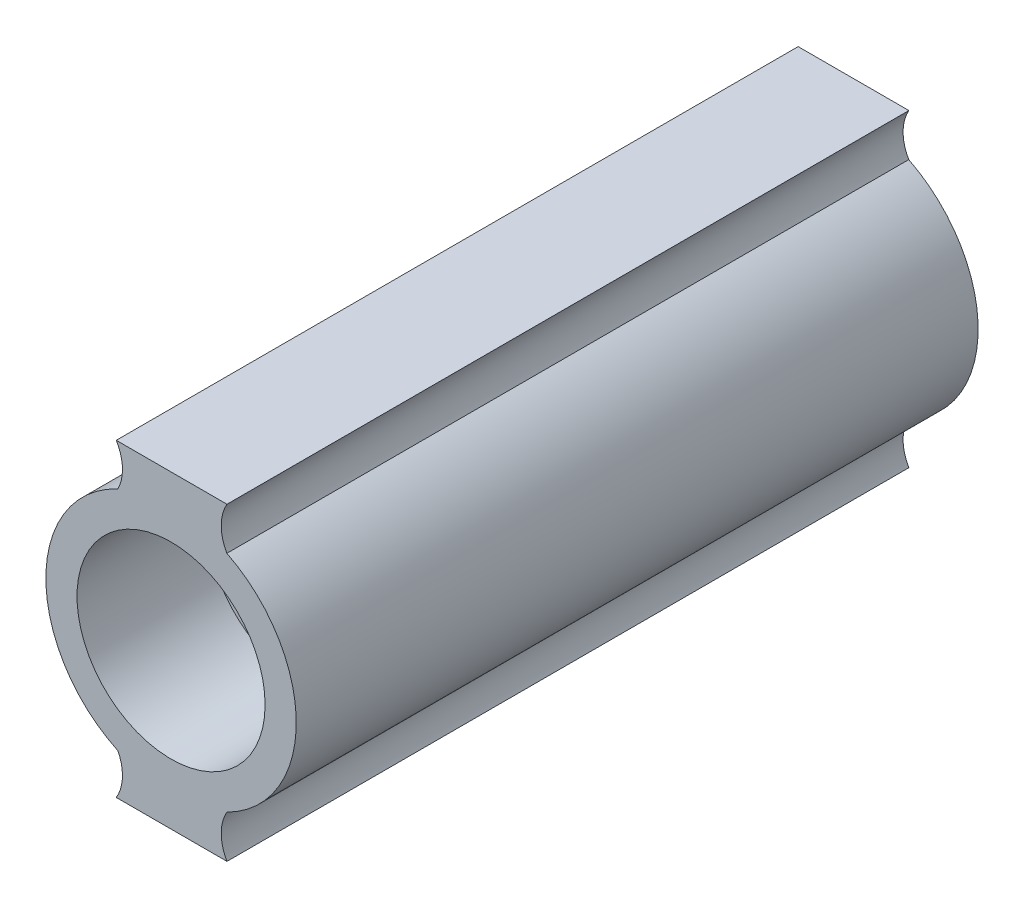
ISO-10303-21;
HEADER;
FILE_DESCRIPTION(('STEP AP214'),'2;1');
FILE_NAME('part.step','',(''),(''),'','','');
FILE_SCHEMA(('AUTOMOTIVE_DESIGN { 1 0 10303 214 1 1 1 1 }'));
ENDSEC;
DATA;
#1=APPLICATION_CONTEXT('core data for automotive mechanical design processes');
#2=APPLICATION_PROTOCOL_DEFINITION('international standard','automotive_design',2000,#1);
#3=PRODUCT_CONTEXT('',#1,'mechanical');
#4=PRODUCT('Part','Part','',(#3));
#5=PRODUCT_RELATED_PRODUCT_CATEGORY('part','',(#4));
#6=PRODUCT_DEFINITION_FORMATION('','',#4);
#7=PRODUCT_DEFINITION_CONTEXT('part definition',#1,'design');
#8=PRODUCT_DEFINITION('design','',#6,#7);
#9=PRODUCT_DEFINITION_SHAPE('','',#8);
#10=(LENGTH_UNIT() NAMED_UNIT(*) SI_UNIT(.MILLI.,.METRE.));
#11=(NAMED_UNIT(*) PLANE_ANGLE_UNIT() SI_UNIT($,.RADIAN.));
#12=(NAMED_UNIT(*) SI_UNIT($,.STERADIAN.) SOLID_ANGLE_UNIT());
#13=UNCERTAINTY_MEASURE_WITH_UNIT(LENGTH_MEASURE(1.E-05),#10,'distance_accuracy_value','');
#14=(GEOMETRIC_REPRESENTATION_CONTEXT(3) GLOBAL_UNCERTAINTY_ASSIGNED_CONTEXT((#13)) GLOBAL_UNIT_ASSIGNED_CONTEXT((#10,
#11,#12)) REPRESENTATION_CONTEXT('',''));
#15=CARTESIAN_POINT('',(0.,0.,0.));
#16=DIRECTION('',(0.,0.,1.));
#17=DIRECTION('',(1.,0.,0.));
#18=AXIS2_PLACEMENT_3D('',#15,#16,#17);
#19=CARTESIAN_POINT('',(-8.08770481711657,2.88846600611306,21.4122));
#20=DIRECTION('',(0.,0.,-1.));
#21=DIRECTION('',(-1.,0.,0.));
#22=AXIS2_PLACEMENT_3D('',#19,#20,#21);
#23=CYLINDRICAL_SURFACE('',#22,18.669);
#24=DIRECTION('',(0.,0.,1.));
#25=VECTOR('',#24,1.);
#26=CARTESIAN_POINT('',(-16.0119195359533,-14.0153318538287,0.));
#27=LINE('',#26,#25);
#28=CARTESIAN_POINT('',(-16.0119195359533,-14.0153318538287,-80.264));
#29=VERTEX_POINT('',#28);
#30=CARTESIAN_POINT('',(-16.0119195359533,-14.0153318538287,21.4122));
#31=VERTEX_POINT('',#30);
#32=EDGE_CURVE('E132',#29,#31,#27,.T.);
#33=ORIENTED_EDGE('',*,*,#32,.T.);
#34=CARTESIAN_POINT('',(-8.08770481711657,2.88846600611306,21.4122));
#35=DIRECTION('',(0.,0.,1.));
#36=DIRECTION('',(1.,0.,0.));
#37=AXIS2_PLACEMENT_3D('',#34,#35,#36);
#38=CIRCLE('',#37,18.669);
#39=CARTESIAN_POINT('',(-16.0119195359533,19.7922638660548,21.4122));
#40=VERTEX_POINT('',#39);
#41=EDGE_CURVE('E204',#40,#31,#38,.T.);
#42=ORIENTED_EDGE('',*,*,#41,.F.);
#43=DIRECTION('',(0.,0.,1.));
#44=VECTOR('',#43,1.);
#45=CARTESIAN_POINT('',(-16.0119195359533,19.7922638660548,0.));
#46=LINE('',#45,#44);
#47=CARTESIAN_POINT('',(-16.0119195359533,19.7922638660548,-80.264));
#48=VERTEX_POINT('',#47);
#49=EDGE_CURVE('E146',#48,#40,#46,.T.);
#50=ORIENTED_EDGE('',*,*,#49,.F.);
#51=CARTESIAN_POINT('',(-8.08770481711657,2.88846600611306,-80.264));
#52=DIRECTION('',(0.,0.,-1.));
#53=DIRECTION('',(-1.,0.,0.));
#54=AXIS2_PLACEMENT_3D('',#51,#52,#53);
#55=CIRCLE('',#54,18.669);
#56=EDGE_CURVE('E145',#29,#48,#55,.T.);
#57=ORIENTED_EDGE('',*,*,#56,.F.);
#58=EDGE_LOOP('',(#33,#42,#50,#57));
#59=FACE_BOUND('',#58,.T.);
#60=ADVANCED_FACE('F65',(#59),#23,.T.);
#61=CARTESIAN_POINT('',(0.233391542479405,-13.8235331673646,21.4122));
#62=VERTEX_POINT('',#61);
#63=CARTESIAN_POINT('',(0.233391542479406,19.6004651795907,21.4122));
#64=VERTEX_POINT('',#63);
#65=EDGE_CURVE('E203',#62,#64,#38,.T.);
#66=ORIENTED_EDGE('',*,*,#65,.F.);
#67=DIRECTION('',(0.,0.,1.));
#68=VECTOR('',#67,1.);
#69=CARTESIAN_POINT('',(0.233391542479405,-13.8235331673646,0.));
#70=LINE('',#69,#68);
#71=CARTESIAN_POINT('',(0.233391542479411,-13.8235331673646,-80.264));
#72=VERTEX_POINT('',#71);
#73=EDGE_CURVE('E142',#72,#62,#70,.T.);
#74=ORIENTED_EDGE('',*,*,#73,.F.);
#75=CARTESIAN_POINT('',(-8.08770481711657,2.88846600611306,-80.264));
#76=DIRECTION('',(0.,0.,-1.));
#77=DIRECTION('',(-1.,0.,0.));
#78=AXIS2_PLACEMENT_3D('',#75,#76,#77);
#79=CIRCLE('',#78,18.669);
#80=CARTESIAN_POINT('',(0.233391542479412,19.6004651795907,-80.264));
#81=VERTEX_POINT('',#80);
#82=EDGE_CURVE('E171',#81,#72,#79,.T.);
#83=ORIENTED_EDGE('',*,*,#82,.F.);
#84=DIRECTION('',(0.,0.,1.));
#85=VECTOR('',#84,1.);
#86=CARTESIAN_POINT('',(0.233391542479406,19.6004651795907,0.));
#87=LINE('',#86,#85);
#88=EDGE_CURVE('E192',#81,#64,#87,.T.);
#89=ORIENTED_EDGE('',*,*,#88,.T.);
#90=EDGE_LOOP('',(#66,#74,#83,#89));
#91=FACE_BOUND('',#90,.T.);
#92=ADVANCED_FACE('F283',(#91),#23,.T.);
#93=CARTESIAN_POINT('',(0.,0.,0.00254));
#94=DIRECTION('',(0.,0.,1.));
#95=DIRECTION('',(1.,0.,0.));
#96=AXIS2_PLACEMENT_3D('',#93,#94,#95);
#97=PLANE('',#96);
#98=CARTESIAN_POINT('',(-8.08770481711657,11.2387160061131,0.00254));
#99=DIRECTION('',(0.,0.,1.));
#100=DIRECTION('',(1.,0.,0.));
#101=AXIS2_PLACEMENT_3D('',#98,#99,#100);
#102=ELLIPSE('',#101,3.2131,3.20675);
#103=CARTESIAN_POINT('',(-4.87460481711657,11.2387160061131,0.00254));
#104=VERTEX_POINT('',#103);
#105=EDGE_CURVE('E12',#104,#104,#102,.T.);
#106=ORIENTED_EDGE('',*,*,#105,.T.);
#107=EDGE_LOOP('',(#106));
#108=FACE_BOUND('',#107,.T.);
#109=ADVANCED_FACE('F67',(#108),#97,.T.);
#110=CARTESIAN_POINT('',(0.,0.,1.9812));
#111=DIRECTION('',(0.,0.,1.));
#112=DIRECTION('',(1.,0.,0.));
#113=AXIS2_PLACEMENT_3D('',#110,#111,#112);
#114=PLANE('',#113);
#115=CARTESIAN_POINT('',(0.262545182883519,2.88846600611303,1.9812));
#116=DIRECTION('',(0.,0.,1.));
#117=DIRECTION('',(0.,-1.,0.));
#118=AXIS2_PLACEMENT_3D('',#115,#116,#117);
#119=ELLIPSE('',#118,3.2131,3.20675);
#120=CARTESIAN_POINT('',(0.262545182883508,-0.324633993886968,1.9812));
#121=VERTEX_POINT('',#120);
#122=EDGE_CURVE('E228',#121,#121,#119,.T.);
#123=ORIENTED_EDGE('',*,*,#122,.F.);
#124=EDGE_LOOP('',(#123));
#125=FACE_BOUND('',#124,.T.);
#126=CARTESIAN_POINT('',(-8.08770481711657,11.2387160061131,1.9812));
#127=DIRECTION('',(0.,0.,1.));
#128=DIRECTION('',(1.,0.,0.));
#129=AXIS2_PLACEMENT_3D('',#126,#127,#128);
#130=ELLIPSE('',#129,3.2131,3.20675);
#131=CARTESIAN_POINT('',(-4.87460481711657,11.2387160061131,1.9812));
#132=VERTEX_POINT('',#131);
#133=EDGE_CURVE('E246',#132,#132,#130,.T.);
#134=ORIENTED_EDGE('',*,*,#133,.F.);
#135=EDGE_LOOP('',(#134));
#136=FACE_BOUND('',#135,.T.);
#137=CARTESIAN_POINT('',(-16.4379548171166,2.88846600611315,1.9812));
#138=DIRECTION('',(0.,0.,1.));
#139=DIRECTION('',(0.,1.,0.));
#140=AXIS2_PLACEMENT_3D('',#137,#138,#139);
#141=ELLIPSE('',#140,3.2131,3.20675);
#142=CARTESIAN_POINT('',(-16.4379548171166,6.10156600611315,1.9812));
#143=VERTEX_POINT('',#142);
#144=EDGE_CURVE('E73',#143,#143,#141,.T.);
#145=ORIENTED_EDGE('',*,*,#144,.F.);
#146=EDGE_LOOP('',(#145));
#147=FACE_BOUND('',#146,.T.);
#148=CARTESIAN_POINT('',(-8.08770481711657,-5.46178399388694,1.9812));
#149=DIRECTION('',(0.,0.,1.));
#150=DIRECTION('',(-1.,0.,0.));
#151=AXIS2_PLACEMENT_3D('',#148,#149,#150);
#152=ELLIPSE('',#151,3.2131,3.20675);
#153=CARTESIAN_POINT('',(-11.3008048171166,-5.46178399388694,1.9812));
#154=VERTEX_POINT('',#153);
#155=EDGE_CURVE('E222',#154,#154,#152,.T.);
#156=ORIENTED_EDGE('',*,*,#155,.F.);
#157=EDGE_LOOP('',(#156));
#158=FACE_BOUND('',#157,.T.);
#159=CARTESIAN_POINT('',(-8.08770481711657,2.88846600611306,1.9812));
#160=DIRECTION('',(0.,0.,1.));
#161=DIRECTION('',(1.,0.,0.));
#162=AXIS2_PLACEMENT_3D('',#159,#160,#161);
#163=CIRCLE('',#162,4.7625000000001);
#164=CARTESIAN_POINT('',(-3.32520481711647,2.88846600611306,1.9812));
#165=VERTEX_POINT('',#164);
#166=EDGE_CURVE('E219',#165,#165,#163,.T.);
#167=ORIENTED_EDGE('',*,*,#166,.F.);
#168=EDGE_LOOP('',(#167));
#169=FACE_BOUND('',#168,.T.);
#170=CARTESIAN_POINT('',(-8.08770481711657,2.88846600611306,1.9812));
#171=DIRECTION('',(0.,0.,1.));
#172=DIRECTION('',(1.,0.,0.));
#173=AXIS2_PLACEMENT_3D('',#170,#171,#172);
#174=CIRCLE('',#173,14.02334);
#175=CARTESIAN_POINT('',(5.93563518288343,2.88846600611306,1.9812));
#176=VERTEX_POINT('',#175);
#177=EDGE_CURVE('E206',#176,#176,#174,.F.);
#178=ORIENTED_EDGE('',*,*,#177,.F.);
#179=EDGE_LOOP('',(#178));
#180=FACE_BOUND('',#179,.T.);
#181=ADVANCED_FACE('F235',(#125,#136,#147,#158,#169,#180),#114,.T.);
#182=DIRECTION('',(0.,0.,-1.));
#183=VECTOR('',#182,1.);
#184=SURFACE_OF_LINEAR_EXTRUSION('',#152,#183);
#185=CARTESIAN_POINT('',(-8.08770481711657,-5.46178399388694,0.00254));
#186=DIRECTION('',(0.,0.,1.));
#187=DIRECTION('',(-1.,0.,0.));
#188=AXIS2_PLACEMENT_3D('',#185,#186,#187);
#189=ELLIPSE('',#188,3.2131,3.20675);
#190=CARTESIAN_POINT('',(-11.3008048171166,-5.46178399388694,0.00254));
#191=VERTEX_POINT('',#190);
#192=EDGE_CURVE('E212',#191,#191,#189,.T.);
#193=ORIENTED_EDGE('',*,*,#192,.F.);
#194=EDGE_LOOP('',(#193));
#195=FACE_BOUND('',#194,.T.);
#196=ORIENTED_EDGE('',*,*,#155,.T.);
#197=EDGE_LOOP('',(#196));
#198=FACE_BOUND('',#197,.T.);
#199=ADVANCED_FACE('F231',(#195,#198),#184,.T.);
#200=DIRECTION('',(0.,0.,-1.));
#201=VECTOR('',#200,1.);
#202=SURFACE_OF_LINEAR_EXTRUSION('',#119,#201);
#203=CARTESIAN_POINT('',(0.262545182883519,2.88846600611303,0.00254));
#204=DIRECTION('',(0.,0.,1.));
#205=DIRECTION('',(0.,-1.,0.));
#206=AXIS2_PLACEMENT_3D('',#203,#204,#205);
#207=ELLIPSE('',#206,3.2131,3.20675);
#208=CARTESIAN_POINT('',(0.262545182883508,-0.324633993886968,0.00254));
#209=VERTEX_POINT('',#208);
#210=EDGE_CURVE('E209',#209,#209,#207,.T.);
#211=ORIENTED_EDGE('',*,*,#210,.F.);
#212=EDGE_LOOP('',(#211));
#213=FACE_BOUND('',#212,.T.);
#214=ORIENTED_EDGE('',*,*,#122,.T.);
#215=EDGE_LOOP('',(#214));
#216=FACE_BOUND('',#215,.T.);
#217=ADVANCED_FACE('F234',(#213,#216),#202,.T.);
#218=DIRECTION('',(0.,0.,-1.));
#219=VECTOR('',#218,1.);
#220=SURFACE_OF_LINEAR_EXTRUSION('',#130,#219);
#221=ORIENTED_EDGE('',*,*,#105,.F.);
#222=EDGE_LOOP('',(#221));
#223=FACE_BOUND('',#222,.T.);
#224=ORIENTED_EDGE('',*,*,#133,.T.);
#225=EDGE_LOOP('',(#224));
#226=FACE_BOUND('',#225,.T.);
#227=ADVANCED_FACE('F239',(#223,#226),#220,.T.);
#228=DIRECTION('',(0.,0.,-1.));
#229=VECTOR('',#228,1.);
#230=SURFACE_OF_LINEAR_EXTRUSION('',#141,#229);
#231=CARTESIAN_POINT('',(-16.4379548171166,2.88846600611315,0.00254));
#232=DIRECTION('',(0.,0.,1.));
#233=DIRECTION('',(0.,1.,0.));
#234=AXIS2_PLACEMENT_3D('',#231,#232,#233);
#235=ELLIPSE('',#234,3.2131,3.20675);
#236=CARTESIAN_POINT('',(-16.4379548171166,6.10156600611315,0.00254));
#237=VERTEX_POINT('',#236);
#238=EDGE_CURVE('E215',#237,#237,#235,.T.);
#239=ORIENTED_EDGE('',*,*,#238,.F.);
#240=EDGE_LOOP('',(#239));
#241=FACE_BOUND('',#240,.T.);
#242=ORIENTED_EDGE('',*,*,#144,.T.);
#243=EDGE_LOOP('',(#242));
#244=FACE_BOUND('',#243,.T.);
#245=ADVANCED_FACE('F243',(#241,#244),#230,.T.);
#246=CARTESIAN_POINT('',(-8.08770481711657,2.88846600611306,1.9812));
#247=DIRECTION('',(0.,0.,-1.));
#248=DIRECTION('',(-1.,0.,0.));
#249=AXIS2_PLACEMENT_3D('',#246,#247,#248);
#250=CYLINDRICAL_SURFACE('',#249,4.7625000000001);
#251=ORIENTED_EDGE('',*,*,#166,.T.);
#252=EDGE_LOOP('',(#251));
#253=FACE_BOUND('',#252,.T.);
#254=CARTESIAN_POINT('',(-8.08770481711657,2.88846600611306,0.));
#255=DIRECTION('',(0.,0.,1.));
#256=DIRECTION('',(1.,0.,0.));
#257=AXIS2_PLACEMENT_3D('',#254,#255,#256);
#258=CIRCLE('',#257,4.7625000000001);
#259=CARTESIAN_POINT('',(-3.32520481711647,2.88846600611306,0.));
#260=VERTEX_POINT('',#259);
#261=EDGE_CURVE('E218',#260,#260,#258,.T.);
#262=ORIENTED_EDGE('',*,*,#261,.F.);
#263=EDGE_LOOP('',(#262));
#264=FACE_BOUND('',#263,.T.);
#265=ADVANCED_FACE('F317',(#253,#264),#250,.F.);
#266=CARTESIAN_POINT('',(0.,0.,0.00254));
#267=DIRECTION('',(0.,0.,1.));
#268=DIRECTION('',(1.,0.,0.));
#269=AXIS2_PLACEMENT_3D('',#266,#267,#268);
#270=PLANE('',#269);
#271=ORIENTED_EDGE('',*,*,#238,.T.);
#272=EDGE_LOOP('',(#271));
#273=FACE_BOUND('',#272,.T.);
#274=ADVANCED_FACE('F313',(#273),#270,.T.);
#275=CARTESIAN_POINT('',(0.,0.,0.00254));
#276=DIRECTION('',(0.,0.,1.));
#277=DIRECTION('',(1.,0.,0.));
#278=AXIS2_PLACEMENT_3D('',#275,#276,#277);
#279=PLANE('',#278);
#280=ORIENTED_EDGE('',*,*,#192,.T.);
#281=EDGE_LOOP('',(#280));
#282=FACE_BOUND('',#281,.T.);
#283=ADVANCED_FACE('F309',(#282),#279,.T.);
#284=CARTESIAN_POINT('',(0.,0.,0.00254));
#285=DIRECTION('',(0.,0.,1.));
#286=DIRECTION('',(1.,0.,0.));
#287=AXIS2_PLACEMENT_3D('',#284,#285,#286);
#288=PLANE('',#287);
#289=ORIENTED_EDGE('',*,*,#210,.T.);
#290=EDGE_LOOP('',(#289));
#291=FACE_BOUND('',#290,.T.);
#292=ADVANCED_FACE('F267',(#291),#288,.T.);
#293=CARTESIAN_POINT('',(-8.08770481711657,2.88846600611306,21.4122));
#294=DIRECTION('',(0.,0.,-1.));
#295=DIRECTION('',(-1.,0.,0.));
#296=AXIS2_PLACEMENT_3D('',#293,#294,#295);
#297=CYLINDRICAL_SURFACE('',#296,14.02334);
#298=ORIENTED_EDGE('',*,*,#177,.T.);
#299=EDGE_LOOP('',(#298));
#300=FACE_BOUND('',#299,.T.);
#301=CARTESIAN_POINT('',(-8.08770481711657,2.88846600611306,21.4122));
#302=DIRECTION('',(0.,0.,1.));
#303=DIRECTION('',(1.,0.,0.));
#304=AXIS2_PLACEMENT_3D('',#301,#302,#303);
#305=CIRCLE('',#304,14.02334);
#306=CARTESIAN_POINT('',(5.93563518288343,2.88846600611306,21.4122));
#307=VERTEX_POINT('',#306);
#308=EDGE_CURVE('E195',#307,#307,#305,.T.);
#309=ORIENTED_EDGE('',*,*,#308,.T.);
#310=EDGE_LOOP('',(#309));
#311=FACE_BOUND('',#310,.T.);
#312=ADVANCED_FACE('F263',(#300,#311),#297,.F.);
#313=CARTESIAN_POINT('',(0.,0.,21.4122));
#314=DIRECTION('',(0.,0.,1.));
#315=DIRECTION('',(1.,0.,0.));
#316=AXIS2_PLACEMENT_3D('',#313,#314,#315);
#317=PLANE('',#316);
#318=ORIENTED_EDGE('',*,*,#308,.F.);
#319=EDGE_LOOP('',(#318));
#320=FACE_BOUND('',#319,.T.);
#321=ORIENTED_EDGE('',*,*,#41,.T.);
#322=CARTESIAN_POINT('',(-21.6826139640238,-16.872905073092,21.4122));
#323=DIRECTION('',(0.,0.,1.));
#324=DIRECTION('',(1.,0.,0.));
#325=AXIS2_PLACEMENT_3D('',#322,#323,#324);
#326=CIRCLE('',#325,6.35);
#327=CARTESIAN_POINT('',(-16.257823259923,-20.1735331673646,21.4122));
#328=VERTEX_POINT('',#327);
#329=EDGE_CURVE('E138',#328,#31,#326,.T.);
#330=ORIENTED_EDGE('',*,*,#329,.F.);
#331=DIRECTION('',(1.,0.,0.));
#332=VECTOR('',#331,1.);
#333=CARTESIAN_POINT('',(0.,-20.1735331673646,21.4122));
#334=LINE('',#333,#332);
#335=CARTESIAN_POINT('',(0.252176740077017,-20.1735331673646,21.4122));
#336=VERTEX_POINT('',#335);
#337=EDGE_CURVE('E177',#328,#336,#334,.T.);
#338=ORIENTED_EDGE('',*,*,#337,.T.);
#339=CARTESIAN_POINT('',(5.74201337085571,-16.9822648039454,21.4122));
#340=DIRECTION('',(0.,0.,1.));
#341=DIRECTION('',(1.,0.,0.));
#342=AXIS2_PLACEMENT_3D('',#339,#340,#341);
#343=CIRCLE('',#342,6.35);
#344=EDGE_CURVE('E80',#336,#62,#343,.F.);
#345=ORIENTED_EDGE('',*,*,#344,.T.);
#346=ORIENTED_EDGE('',*,*,#65,.T.);
#347=CARTESIAN_POINT('',(5.74201337085571,22.7591968161715,21.4122));
#348=DIRECTION('',(0.,0.,1.));
#349=DIRECTION('',(1.,0.,0.));
#350=AXIS2_PLACEMENT_3D('',#347,#348,#349);
#351=CIRCLE('',#350,6.35);
#352=CARTESIAN_POINT('',(0.252176740077017,25.9504651795907,21.4122));
#353=VERTEX_POINT('',#352);
#354=EDGE_CURVE('E182',#353,#64,#351,.T.);
#355=ORIENTED_EDGE('',*,*,#354,.F.);
#356=DIRECTION('',(1.,0.,0.));
#357=VECTOR('',#356,1.);
#358=CARTESIAN_POINT('',(0.,25.9504651795907,21.4122));
#359=LINE('',#358,#357);
#360=CARTESIAN_POINT('',(-16.257823259923,25.9504651795907,21.4122));
#361=VERTEX_POINT('',#360);
#362=EDGE_CURVE('E188',#361,#353,#359,.T.);
#363=ORIENTED_EDGE('',*,*,#362,.F.);
#364=CARTESIAN_POINT('',(-21.6826139640238,22.6498370853181,21.4122));
#365=DIRECTION('',(0.,0.,1.));
#366=DIRECTION('',(1.,0.,0.));
#367=AXIS2_PLACEMENT_3D('',#364,#365,#366);
#368=CIRCLE('',#367,6.35);
#369=EDGE_CURVE('E87',#361,#40,#368,.F.);
#370=ORIENTED_EDGE('',*,*,#369,.T.);
#371=EDGE_LOOP('',(#321,#330,#338,#345,#346,#355,#363,#370));
#372=FACE_BOUND('',#371,.T.);
#373=ADVANCED_FACE('F266',(#320,#372),#317,.T.);
#374=CARTESIAN_POINT('',(5.74201337085571,22.7591968161715,0.));
#375=DIRECTION('',(0.,0.,1.));
#376=DIRECTION('',(1.,0.,0.));
#377=AXIS2_PLACEMENT_3D('',#374,#375,#376);
#378=CYLINDRICAL_SURFACE('',#377,6.35);
#379=ORIENTED_EDGE('',*,*,#354,.T.);
#380=ORIENTED_EDGE('',*,*,#88,.F.);
#381=CARTESIAN_POINT('',(5.74201337085571,22.7591968161715,-80.264));
#382=DIRECTION('',(0.,0.,-1.));
#383=DIRECTION('',(-1.,0.,0.));
#384=AXIS2_PLACEMENT_3D('',#381,#382,#383);
#385=CIRCLE('',#384,6.35);
#386=CARTESIAN_POINT('',(0.252176740077017,25.9504651795907,-80.264));
#387=VERTEX_POINT('',#386);
#388=EDGE_CURVE('E168',#387,#81,#385,.F.);
#389=ORIENTED_EDGE('',*,*,#388,.F.);
#390=DIRECTION('',(0.,0.,1.));
#391=VECTOR('',#390,1.);
#392=CARTESIAN_POINT('',(0.252176740077017,25.9504651795907,0.));
#393=LINE('',#392,#391);
#394=EDGE_CURVE('E191',#387,#353,#393,.T.);
#395=ORIENTED_EDGE('',*,*,#394,.T.);
#396=EDGE_LOOP('',(#379,#380,#389,#395));
#397=FACE_BOUND('',#396,.T.);
#398=ADVANCED_FACE('F272',(#397),#378,.F.);
#399=CARTESIAN_POINT('',(-21.6826139640238,22.6498370853181,0.));
#400=DIRECTION('',(0.,0.,1.));
#401=DIRECTION('',(1.,0.,0.));
#402=AXIS2_PLACEMENT_3D('',#399,#400,#401);
#403=CYLINDRICAL_SURFACE('',#402,6.35);
#404=ORIENTED_EDGE('',*,*,#369,.F.);
#405=DIRECTION('',(0.,0.,1.));
#406=VECTOR('',#405,1.);
#407=CARTESIAN_POINT('',(-16.257823259923,25.9504651795907,0.));
#408=LINE('',#407,#406);
#409=CARTESIAN_POINT('',(-16.257823259923,25.9504651795907,-80.264));
#410=VERTEX_POINT('',#409);
#411=EDGE_CURVE('E197',#410,#361,#408,.T.);
#412=ORIENTED_EDGE('',*,*,#411,.F.);
#413=CARTESIAN_POINT('',(-21.6826139640238,22.6498370853181,-80.264));
#414=DIRECTION('',(0.,0.,-1.));
#415=DIRECTION('',(-1.,0.,0.));
#416=AXIS2_PLACEMENT_3D('',#413,#414,#415);
#417=CIRCLE('',#416,6.35);
#418=EDGE_CURVE('E150',#48,#410,#417,.F.);
#419=ORIENTED_EDGE('',*,*,#418,.F.);
#420=ORIENTED_EDGE('',*,*,#49,.T.);
#421=EDGE_LOOP('',(#404,#412,#419,#420));
#422=FACE_BOUND('',#421,.T.);
#423=ADVANCED_FACE('F291',(#422),#403,.F.);
#424=CARTESIAN_POINT('',(0.,25.9504651795907,0.));
#425=DIRECTION('',(0.,-1.,0.));
#426=DIRECTION('',(0.,0.,-1.));
#427=AXIS2_PLACEMENT_3D('',#424,#425,#426);
#428=PLANE('',#427);
#429=ORIENTED_EDGE('',*,*,#362,.T.);
#430=ORIENTED_EDGE('',*,*,#394,.F.);
#431=DIRECTION('',(1.,0.,0.));
#432=VECTOR('',#431,1.);
#433=CARTESIAN_POINT('',(0.,25.9504651795907,-80.264));
#434=LINE('',#433,#432);
#435=EDGE_CURVE('E165',#410,#387,#434,.T.);
#436=ORIENTED_EDGE('',*,*,#435,.F.);
#437=ORIENTED_EDGE('',*,*,#411,.T.);
#438=EDGE_LOOP('',(#429,#430,#436,#437));
#439=FACE_BOUND('',#438,.T.);
#440=ADVANCED_FACE('F289',(#439),#428,.F.);
#441=CARTESIAN_POINT('',(0.,-20.1735331673646,0.));
#442=DIRECTION('',(0.,-1.,0.));
#443=DIRECTION('',(0.,0.,-1.));
#444=AXIS2_PLACEMENT_3D('',#441,#442,#443);
#445=PLANE('',#444);
#446=ORIENTED_EDGE('',*,*,#337,.F.);
#447=DIRECTION('',(0.,0.,1.));
#448=VECTOR('',#447,1.);
#449=CARTESIAN_POINT('',(-16.257823259923,-20.1735331673646,0.));
#450=LINE('',#449,#448);
#451=CARTESIAN_POINT('',(-16.257823259923,-20.1735331673646,-80.264));
#452=VERTEX_POINT('',#451);
#453=EDGE_CURVE('E141',#452,#328,#450,.T.);
#454=ORIENTED_EDGE('',*,*,#453,.F.);
#455=DIRECTION('',(-1.,0.,0.));
#456=VECTOR('',#455,1.);
#457=CARTESIAN_POINT('',(0.,-20.1735331673646,-80.264));
#458=LINE('',#457,#456);
#459=CARTESIAN_POINT('',(0.252176740077017,-20.1735331673646,-80.264));
#460=VERTEX_POINT('',#459);
#461=EDGE_CURVE('E156',#460,#452,#458,.T.);
#462=ORIENTED_EDGE('',*,*,#461,.F.);
#463=DIRECTION('',(0.,0.,1.));
#464=VECTOR('',#463,1.);
#465=CARTESIAN_POINT('',(0.252176740077017,-20.1735331673646,0.));
#466=LINE('',#465,#464);
#467=EDGE_CURVE('E181',#460,#336,#466,.T.);
#468=ORIENTED_EDGE('',*,*,#467,.T.);
#469=EDGE_LOOP('',(#446,#454,#462,#468));
#470=FACE_BOUND('',#469,.T.);
#471=ADVANCED_FACE('F276',(#470),#445,.T.);
#472=CARTESIAN_POINT('',(-21.6826139640238,-16.872905073092,0.));
#473=DIRECTION('',(0.,0.,1.));
#474=DIRECTION('',(1.,0.,0.));
#475=AXIS2_PLACEMENT_3D('',#472,#473,#474);
#476=CYLINDRICAL_SURFACE('',#475,6.35);
#477=ORIENTED_EDGE('',*,*,#329,.T.);
#478=ORIENTED_EDGE('',*,*,#32,.F.);
#479=CARTESIAN_POINT('',(-21.6826139640238,-16.872905073092,-80.264));
#480=DIRECTION('',(0.,0.,-1.));
#481=DIRECTION('',(-1.,0.,0.));
#482=AXIS2_PLACEMENT_3D('',#479,#480,#481);
#483=CIRCLE('',#482,6.35);
#484=EDGE_CURVE('E136',#452,#29,#483,.F.);
#485=ORIENTED_EDGE('',*,*,#484,.F.);
#486=ORIENTED_EDGE('',*,*,#453,.T.);
#487=EDGE_LOOP('',(#477,#478,#485,#486));
#488=FACE_BOUND('',#487,.T.);
#489=ADVANCED_FACE('F134',(#488),#476,.F.);
#490=CARTESIAN_POINT('',(5.74201337085571,-16.9822648039454,0.));
#491=DIRECTION('',(0.,0.,1.));
#492=DIRECTION('',(1.,0.,0.));
#493=AXIS2_PLACEMENT_3D('',#490,#491,#492);
#494=CYLINDRICAL_SURFACE('',#493,6.35);
#495=ORIENTED_EDGE('',*,*,#344,.F.);
#496=ORIENTED_EDGE('',*,*,#467,.F.);
#497=CARTESIAN_POINT('',(5.74201337085571,-16.9822648039454,-80.264));
#498=DIRECTION('',(0.,0.,-1.));
#499=DIRECTION('',(-1.,0.,0.));
#500=AXIS2_PLACEMENT_3D('',#497,#498,#499);
#501=CIRCLE('',#500,6.35);
#502=EDGE_CURVE('E174',#72,#460,#501,.F.);
#503=ORIENTED_EDGE('',*,*,#502,.F.);
#504=ORIENTED_EDGE('',*,*,#73,.T.);
#505=EDGE_LOOP('',(#495,#496,#503,#504));
#506=FACE_BOUND('',#505,.T.);
#507=ADVANCED_FACE('F279',(#506),#494,.F.);
#508=CARTESIAN_POINT('',(0.,0.,0.));
#509=DIRECTION('',(0.,0.,-1.));
#510=DIRECTION('',(-1.,0.,0.));
#511=AXIS2_PLACEMENT_3D('',#508,#509,#510);
#512=PLANE('',#511);
#513=CARTESIAN_POINT('',(-8.08770481711657,2.88846600611306,0.));
#514=DIRECTION('',(0.,0.,1.));
#515=DIRECTION('',(1.,0.,0.));
#516=AXIS2_PLACEMENT_3D('',#513,#514,#515);
#517=CIRCLE('',#516,4.064);
#518=CARTESIAN_POINT('',(-4.02370481711657,2.88846600611306,0.));
#519=VERTEX_POINT('',#518);
#520=EDGE_CURVE('E160',#519,#519,#517,.T.);
#521=ORIENTED_EDGE('',*,*,#520,.F.);
#522=EDGE_LOOP('',(#521));
#523=FACE_BOUND('',#522,.T.);
#524=ORIENTED_EDGE('',*,*,#261,.T.);
#525=EDGE_LOOP('',(#524));
#526=FACE_BOUND('',#525,.T.);
#527=ADVANCED_FACE('F328',(#523,#526),#512,.F.);
#528=CARTESIAN_POINT('',(0.,0.,-80.264));
#529=DIRECTION('',(0.,0.,-1.));
#530=DIRECTION('',(-1.,0.,0.));
#531=AXIS2_PLACEMENT_3D('',#528,#529,#530);
#532=PLANE('',#531);
#533=CARTESIAN_POINT('',(-8.08770481711657,2.88846600611306,-80.264));
#534=DIRECTION('',(0.,0.,-1.));
#535=DIRECTION('',(-1.,0.,0.));
#536=AXIS2_PLACEMENT_3D('',#533,#534,#535);
#537=CIRCLE('',#536,3.556);
#538=CARTESIAN_POINT('',(-11.6437048171166,2.88846600611306,-80.264));
#539=VERTEX_POINT('',#538);
#540=EDGE_CURVE('E413',#539,#539,#537,.T.);
#541=ORIENTED_EDGE('',*,*,#540,.F.);
#542=EDGE_LOOP('',(#541));
#543=FACE_BOUND('',#542,.T.);
#544=ORIENTED_EDGE('',*,*,#484,.T.);
#545=ORIENTED_EDGE('',*,*,#56,.T.);
#546=ORIENTED_EDGE('',*,*,#418,.T.);
#547=ORIENTED_EDGE('',*,*,#435,.T.);
#548=ORIENTED_EDGE('',*,*,#388,.T.);
#549=ORIENTED_EDGE('',*,*,#82,.T.);
#550=ORIENTED_EDGE('',*,*,#502,.T.);
#551=ORIENTED_EDGE('',*,*,#461,.T.);
#552=EDGE_LOOP('',(#544,#545,#546,#547,#548,#549,#550,#551));
#553=FACE_BOUND('',#552,.T.);
#554=ADVANCED_FACE('F153',(#543,#553),#532,.T.);
#555=CARTESIAN_POINT('',(-8.08770481711657,2.88846600611306,-11.938));
#556=DIRECTION('',(0.,0.,1.));
#557=DIRECTION('',(1.,0.,0.));
#558=AXIS2_PLACEMENT_3D('',#555,#556,#557);
#559=CYLINDRICAL_SURFACE('',#558,4.064);
#560=CARTESIAN_POINT('',(-8.08770481711657,2.88846600611306,-11.938));
#561=DIRECTION('',(0.,0.,1.));
#562=DIRECTION('',(1.,0.,0.));
#563=AXIS2_PLACEMENT_3D('',#560,#561,#562);
#564=CIRCLE('',#563,4.064);
#565=CARTESIAN_POINT('',(-4.02370481711657,2.88846600611306,-11.938));
#566=VERTEX_POINT('',#565);
#567=EDGE_CURVE('E157',#566,#566,#564,.T.);
#568=ORIENTED_EDGE('',*,*,#567,.F.);
#569=EDGE_LOOP('',(#568));
#570=FACE_BOUND('',#569,.T.);
#571=ORIENTED_EDGE('',*,*,#520,.T.);
#572=EDGE_LOOP('',(#571));
#573=FACE_BOUND('',#572,.T.);
#574=ADVANCED_FACE('F336',(#570,#573),#559,.F.);
#575=CARTESIAN_POINT('',(-8.08770481711657,2.88846600611306,-11.938));
#576=DIRECTION('',(0.,0.,1.));
#577=DIRECTION('',(1.,0.,0.));
#578=AXIS2_PLACEMENT_3D('',#575,#576,#577);
#579=PLANE('',#578);
#580=ORIENTED_EDGE('',*,*,#567,.T.);
#581=EDGE_LOOP('',(#580));
#582=FACE_BOUND('',#581,.T.);
#583=ADVANCED_FACE('F372',(#582),#579,.T.);
#584=CARTESIAN_POINT('',(-8.08770481711657,2.88846600611306,-54.864));
#585=DIRECTION('',(0.,0.,-1.));
#586=DIRECTION('',(-1.,0.,0.));
#587=AXIS2_PLACEMENT_3D('',#584,#585,#586);
#588=CYLINDRICAL_SURFACE('',#587,3.556);
#589=CARTESIAN_POINT('',(-8.08770481711657,2.88846600611306,-54.864));
#590=DIRECTION('',(0.,0.,-1.));
#591=DIRECTION('',(-1.,0.,0.));
#592=AXIS2_PLACEMENT_3D('',#589,#590,#591);
#593=CIRCLE('',#592,3.556);
#594=CARTESIAN_POINT('',(-11.6437048171166,2.88846600611306,-54.864));
#595=VERTEX_POINT('',#594);
#596=EDGE_CURVE('E412',#595,#595,#593,.T.);
#597=ORIENTED_EDGE('',*,*,#596,.F.);
#598=EDGE_LOOP('',(#597));
#599=FACE_BOUND('',#598,.T.);
#600=ORIENTED_EDGE('',*,*,#540,.T.);
#601=EDGE_LOOP('',(#600));
#602=FACE_BOUND('',#601,.T.);
#603=ADVANCED_FACE('F381',(#599,#602),#588,.F.);
#604=CARTESIAN_POINT('',(-8.08770481711657,2.88846600611306,-54.864));
#605=DIRECTION('',(0.,0.,-1.));
#606=DIRECTION('',(-1.,0.,0.));
#607=AXIS2_PLACEMENT_3D('',#604,#605,#606);
#608=PLANE('',#607);
#609=ORIENTED_EDGE('',*,*,#596,.T.);
#610=EDGE_LOOP('',(#609));
#611=FACE_BOUND('',#610,.T.);
#612=ADVANCED_FACE('F396',(#611),#608,.T.);
#613=CLOSED_SHELL('',(#60,#92,#109,#181,#199,#217,#227,#245,#265,#274,#283,#292,#312,#373,#398,
#423,#440,#471,#489,#507,#527,#554,#574,#583,#603,#612));
#614=MANIFOLD_SOLID_BREP('B2',#613);
#615=ADVANCED_BREP_SHAPE_REPRESENTATION('',(#18,#614),#14);
#616=SHAPE_DEFINITION_REPRESENTATION(#9,#615);
ENDSEC;
END-ISO-10303-21;
